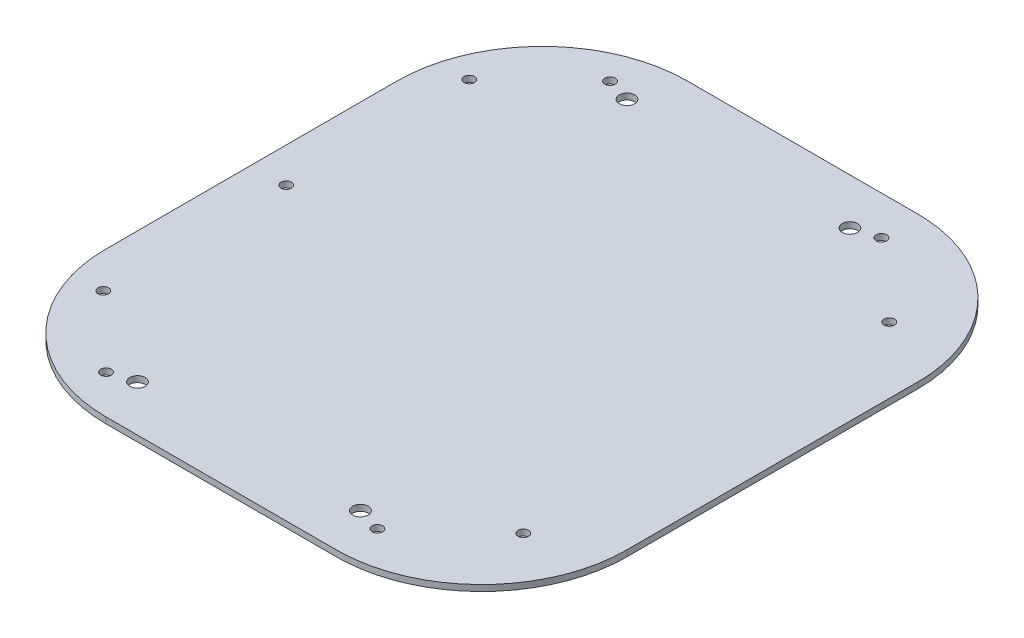
ISO-10303-21;
HEADER;
FILE_DESCRIPTION(('STEP AP214'),'2;1');
FILE_NAME('part.step','',(''),(''),'','','');
FILE_SCHEMA(('AUTOMOTIVE_DESIGN { 1 0 10303 214 1 1 1 1 }'));
ENDSEC;
DATA;
#1=APPLICATION_CONTEXT('core data for automotive mechanical design processes');
#2=APPLICATION_PROTOCOL_DEFINITION('international standard','automotive_design',2000,#1);
#3=PRODUCT_CONTEXT('',#1,'mechanical');
#4=PRODUCT('Part','Part','',(#3));
#5=PRODUCT_RELATED_PRODUCT_CATEGORY('part','',(#4));
#6=PRODUCT_DEFINITION_FORMATION('','',#4);
#7=PRODUCT_DEFINITION_CONTEXT('part definition',#1,'design');
#8=PRODUCT_DEFINITION('design','',#6,#7);
#9=PRODUCT_DEFINITION_SHAPE('','',#8);
#10=(LENGTH_UNIT() NAMED_UNIT(*) SI_UNIT(.MILLI.,.METRE.));
#11=(NAMED_UNIT(*) PLANE_ANGLE_UNIT() SI_UNIT($,.RADIAN.));
#12=(NAMED_UNIT(*) SI_UNIT($,.STERADIAN.) SOLID_ANGLE_UNIT());
#13=UNCERTAINTY_MEASURE_WITH_UNIT(LENGTH_MEASURE(1.E-05),#10,'distance_accuracy_value','');
#14=(GEOMETRIC_REPRESENTATION_CONTEXT(3) GLOBAL_UNCERTAINTY_ASSIGNED_CONTEXT((#13)) GLOBAL_UNIT_ASSIGNED_CONTEXT((#10,
#11,#12)) REPRESENTATION_CONTEXT('',''));
#15=CARTESIAN_POINT('',(0.,0.,0.));
#16=DIRECTION('',(0.,0.,1.));
#17=DIRECTION('',(1.,0.,0.));
#18=AXIS2_PLACEMENT_3D('',#15,#16,#17);
#19=CARTESIAN_POINT('',(95.2373145467114,-2.5,-179.995535183357));
#20=DIRECTION('',(0.,1.,0.));
#21=DIRECTION('',(0.,0.,1.));
#22=AXIS2_PLACEMENT_3D('',#19,#20,#21);
#23=PLANE('',#22);
#24=CARTESIAN_POINT('',(85.9999999999999,-2.5,-160.996));
#25=DIRECTION('',(0.,-1.,0.));
#26=DIRECTION('',(0.,0.,-1.));
#27=AXIS2_PLACEMENT_3D('',#24,#25,#26);
#28=CIRCLE('',#27,3.175);
#29=CARTESIAN_POINT('',(85.9999999999999,-2.5,-164.171));
#30=VERTEX_POINT('',#29);
#31=EDGE_CURVE('E340',#30,#30,#28,.T.);
#32=ORIENTED_EDGE('',*,*,#31,.F.);
#33=EDGE_LOOP('',(#32));
#34=FACE_BOUND('',#33,.T.);
#35=CARTESIAN_POINT('',(-16.,-2.5,-163.996));
#36=DIRECTION('',(0.,-1.,0.));
#37=DIRECTION('',(0.,0.,-1.));
#38=AXIS2_PLACEMENT_3D('',#35,#36,#37);
#39=CIRCLE('',#38,2.159);
#40=CARTESIAN_POINT('',(-16.,-2.5,-166.155));
#41=VERTEX_POINT('',#40);
#42=EDGE_CURVE('E327',#41,#41,#39,.T.);
#43=ORIENTED_EDGE('',*,*,#42,.F.);
#44=EDGE_LOOP('',(#43));
#45=FACE_BOUND('',#44,.T.);
#46=CARTESIAN_POINT('',(-45.6237582645307,-2.5,-135.496));
#47=DIRECTION('',(0.,-1.,0.));
#48=DIRECTION('',(0.,0.,-1.));
#49=AXIS2_PLACEMENT_3D('',#46,#47,#48);
#50=CIRCLE('',#49,2.159);
#51=CARTESIAN_POINT('',(-45.6237582645307,-2.5,-137.655));
#52=VERTEX_POINT('',#51);
#53=EDGE_CURVE('E324',#52,#52,#50,.T.);
#54=ORIENTED_EDGE('',*,*,#53,.F.);
#55=EDGE_LOOP('',(#54));
#56=FACE_BOUND('',#55,.T.);
#57=CARTESIAN_POINT('',(-6.,-2.5,41.));
#58=DIRECTION('',(0.,-1.,0.));
#59=DIRECTION('',(0.,0.,-1.));
#60=AXIS2_PLACEMENT_3D('',#57,#58,#59);
#61=CIRCLE('',#60,3.175);
#62=CARTESIAN_POINT('',(-6.,-2.5,37.825));
#63=VERTEX_POINT('',#62);
#64=EDGE_CURVE('E317',#63,#63,#61,.T.);
#65=ORIENTED_EDGE('',*,*,#64,.F.);
#66=EDGE_LOOP('',(#65));
#67=FACE_BOUND('',#66,.T.);
#68=CARTESIAN_POINT('',(85.9999999999999,-2.5,41.));
#69=DIRECTION('',(0.,-1.,0.));
#70=DIRECTION('',(0.,0.,-1.));
#71=AXIS2_PLACEMENT_3D('',#68,#69,#70);
#72=CIRCLE('',#71,3.175);
#73=CARTESIAN_POINT('',(85.9999999999999,-2.5,37.825));
#74=VERTEX_POINT('',#73);
#75=EDGE_CURVE('E316',#74,#74,#72,.T.);
#76=ORIENTED_EDGE('',*,*,#75,.F.);
#77=EDGE_LOOP('',(#76));
#78=FACE_BOUND('',#77,.T.);
#79=CARTESIAN_POINT('',(95.9999999999998,-2.5,44.));
#80=DIRECTION('',(0.,-1.,0.));
#81=DIRECTION('',(0.,0.,-1.));
#82=AXIS2_PLACEMENT_3D('',#79,#80,#81);
#83=CIRCLE('',#82,2.15899999999999);
#84=CARTESIAN_POINT('',(95.9999999999998,-2.5,41.841));
#85=VERTEX_POINT('',#84);
#86=EDGE_CURVE('E312',#85,#85,#83,.T.);
#87=ORIENTED_EDGE('',*,*,#86,.F.);
#88=EDGE_LOOP('',(#87));
#89=FACE_BOUND('',#88,.T.);
#90=CARTESIAN_POINT('',(-16.,-2.5,44.));
#91=DIRECTION('',(0.,-1.,0.));
#92=DIRECTION('',(0.,0.,-1.));
#93=AXIS2_PLACEMENT_3D('',#90,#91,#92);
#94=CIRCLE('',#93,2.159);
#95=CARTESIAN_POINT('',(-16.,-2.5,41.841));
#96=VERTEX_POINT('',#95);
#97=EDGE_CURVE('E311',#96,#96,#94,.T.);
#98=ORIENTED_EDGE('',*,*,#97,.F.);
#99=EDGE_LOOP('',(#98));
#100=FACE_BOUND('',#99,.T.);
#101=CARTESIAN_POINT('',(-45.6237582645307,-2.5,15.4999999999998));
#102=DIRECTION('',(0.,-1.,0.));
#103=DIRECTION('',(0.,0.,-1.));
#104=AXIS2_PLACEMENT_3D('',#101,#102,#103);
#105=CIRCLE('',#104,2.159);
#106=CARTESIAN_POINT('',(-45.6237582645307,-2.5,13.3409999999998));
#107=VERTEX_POINT('',#106);
#108=EDGE_CURVE('E307',#107,#107,#105,.T.);
#109=ORIENTED_EDGE('',*,*,#108,.F.);
#110=EDGE_LOOP('',(#109));
#111=FACE_BOUND('',#110,.T.);
#112=CARTESIAN_POINT('',(-45.6237582645307,-2.5,-59.998));
#113=DIRECTION('',(0.,-1.,0.));
#114=DIRECTION('',(0.,0.,-1.));
#115=AXIS2_PLACEMENT_3D('',#112,#113,#114);
#116=CIRCLE('',#115,2.159);
#117=CARTESIAN_POINT('',(-45.6237582645307,-2.5,-62.157));
#118=VERTEX_POINT('',#117);
#119=EDGE_CURVE('E303',#118,#118,#116,.T.);
#120=ORIENTED_EDGE('',*,*,#119,.F.);
#121=EDGE_LOOP('',(#120));
#122=FACE_BOUND('',#121,.T.);
#123=CARTESIAN_POINT('',(154.999999997937,-2.5,-119.9965));
#124=CARTESIAN_POINT('',(154.999912456205,-2.5,-130.604682867073));
#125=CARTESIAN_POINT('',(150.820797234942,-2.5,-146.047956153238));
#126=CARTESIAN_POINT('',(137.923088799103,-2.5,-162.919088799103));
#127=CARTESIAN_POINT('',(121.051823621961,-2.5,-175.816898552963));
#128=CARTESIAN_POINT('',(105.60835936,-2.5,-179.996));
#129=CARTESIAN_POINT('',(63.3333333333333,-2.5,-179.996));
#130=CARTESIAN_POINT('',(31.6666666666667,-2.5,-179.996));
#131=CARTESIAN_POINT('',(0.,-2.5,-179.996));
#132=B_SPLINE_CURVE_WITH_KNOTS('',3,(#123,#124,#125,#126,#127,#128,#129,#130,#131),
.UNSPECIFIED.,.F.,.F.,(4,1,1,1,2,4),(0.,0.167080312288074,0.250621780942753,0.334163249597432,
0.501246186906791,1.),.UNSPECIFIED.);
#133=CARTESIAN_POINT('',(155.,-2.5,-119.9965));
#134=VERTEX_POINT('',#133);
#135=CARTESIAN_POINT('',(0.,-2.5,-179.996));
#136=VERTEX_POINT('',#135);
#137=EDGE_CURVE('E405',#134,#136,#132,.T.);
#138=ORIENTED_EDGE('',*,*,#137,.F.);
#139=DIRECTION('',(1.71924646444001E-11,0.,-1.));
#140=VECTOR('',#139,1.);
#141=CARTESIAN_POINT('',(155.,-2.5,-119.9965));
#142=LINE('',#141,#140);
#143=CARTESIAN_POINT('',(154.999999997937,-2.5,0.000499999999985295));
#144=VERTEX_POINT('',#143);
#145=EDGE_CURVE('E224',#144,#134,#142,.T.);
#146=ORIENTED_EDGE('',*,*,#145,.F.);
#147=CARTESIAN_POINT('',(0.,-2.5,60.));
#148=CARTESIAN_POINT('',(31.6666666666667,-2.5,60.));
#149=CARTESIAN_POINT('',(63.3333333333333,-2.5,59.9999999999999));
#150=CARTESIAN_POINT('',(105.60835936,-2.5,60.));
#151=CARTESIAN_POINT('',(121.051823621961,-2.5,55.8208985529632));
#152=CARTESIAN_POINT('',(137.923088799103,-2.5,42.9230887991031));
#153=CARTESIAN_POINT('',(150.820797234942,-2.5,26.0519561532379));
#154=CARTESIAN_POINT('',(154.999912456205,-2.5,10.6086828670733));
#155=CARTESIAN_POINT('',(154.999999997937,-2.5,0.000499999999985295));
#156=B_SPLINE_CURVE_WITH_KNOTS('',3,(#147,#148,#149,#150,#151,#152,#153,#154,#155),
.UNSPECIFIED.,.F.,.F.,(4,2,1,1,1,4),(0.,0.498753813093209,0.665836750402568,0.749378219057247,
0.832919687711926,1.),.UNSPECIFIED.);
#157=CARTESIAN_POINT('',(0.,-2.5,60.));
#158=VERTEX_POINT('',#157);
#159=EDGE_CURVE('E206',#158,#144,#156,.T.);
#160=ORIENTED_EDGE('',*,*,#159,.F.);
#161=CARTESIAN_POINT('',(0.,-2.5,0.));
#162=DIRECTION('',(0.,1.,0.));
#163=DIRECTION('',(0.,0.,1.));
#164=AXIS2_PLACEMENT_3D('',#161,#162,#163);
#165=CIRCLE('',#164,60.);
#166=CARTESIAN_POINT('',(-60.,-2.5,-2.09488880330588E-13));
#167=VERTEX_POINT('',#166);
#168=EDGE_CURVE('E222',#167,#158,#165,.T.);
#169=ORIENTED_EDGE('',*,*,#168,.F.);
#170=DIRECTION('',(0.,0.,1.));
#171=VECTOR('',#170,1.);
#172=CARTESIAN_POINT('',(-60.,-2.5,-119.996));
#173=LINE('',#172,#171);
#174=CARTESIAN_POINT('',(-60.,-2.5,-119.996));
#175=VERTEX_POINT('',#174);
#176=EDGE_CURVE('E228',#175,#167,#173,.T.);
#177=ORIENTED_EDGE('',*,*,#176,.F.);
#178=CARTESIAN_POINT('',(0.,-2.5,-119.996));
#179=DIRECTION('',(0.,1.,0.));
#180=DIRECTION('',(0.,0.,1.));
#181=AXIS2_PLACEMENT_3D('',#178,#179,#180);
#182=CIRCLE('',#181,60.);
#183=EDGE_CURVE('E230',#136,#175,#182,.T.);
#184=ORIENTED_EDGE('',*,*,#183,.F.);
#185=EDGE_LOOP('',(#138,#146,#160,#169,#177,#184));
#186=FACE_BOUND('',#185,.T.);
#187=CARTESIAN_POINT('',(127.710665595896,-2.5,15.4999999999998));
#188=DIRECTION('',(0.,-1.,0.));
#189=DIRECTION('',(0.,0.,-1.));
#190=AXIS2_PLACEMENT_3D('',#187,#188,#189);
#191=CIRCLE('',#190,2.15899999999999);
#192=CARTESIAN_POINT('',(127.710665595896,-2.5,13.3409999999998));
#193=VERTEX_POINT('',#192);
#194=EDGE_CURVE('E299',#193,#193,#191,.T.);
#195=ORIENTED_EDGE('',*,*,#194,.F.);
#196=EDGE_LOOP('',(#195));
#197=FACE_BOUND('',#196,.T.);
#198=CARTESIAN_POINT('',(127.710665595896,-2.5,-135.496));
#199=DIRECTION('',(0.,-1.,0.));
#200=DIRECTION('',(0.,0.,-1.));
#201=AXIS2_PLACEMENT_3D('',#198,#199,#200);
#202=CIRCLE('',#201,2.15899999999999);
#203=CARTESIAN_POINT('',(127.710665595896,-2.5,-137.655));
#204=VERTEX_POINT('',#203);
#205=EDGE_CURVE('E321',#204,#204,#202,.T.);
#206=ORIENTED_EDGE('',*,*,#205,.F.);
#207=EDGE_LOOP('',(#206));
#208=FACE_BOUND('',#207,.T.);
#209=CARTESIAN_POINT('',(95.9999999999998,-2.5,-163.996));
#210=DIRECTION('',(0.,-1.,0.));
#211=DIRECTION('',(0.,0.,-1.));
#212=AXIS2_PLACEMENT_3D('',#209,#210,#211);
#213=CIRCLE('',#212,2.15899999999999);
#214=CARTESIAN_POINT('',(95.9999999999998,-2.5,-166.155));
#215=VERTEX_POINT('',#214);
#216=EDGE_CURVE('E328',#215,#215,#213,.T.);
#217=ORIENTED_EDGE('',*,*,#216,.F.);
#218=EDGE_LOOP('',(#217));
#219=FACE_BOUND('',#218,.T.);
#220=CARTESIAN_POINT('',(-6.,-2.5,-160.996));
#221=DIRECTION('',(0.,-1.,0.));
#222=DIRECTION('',(0.,0.,-1.));
#223=AXIS2_PLACEMENT_3D('',#220,#221,#222);
#224=CIRCLE('',#223,3.175);
#225=CARTESIAN_POINT('',(-6.,-2.5,-164.171));
#226=VERTEX_POINT('',#225);
#227=EDGE_CURVE('E523',#226,#226,#224,.T.);
#228=ORIENTED_EDGE('',*,*,#227,.F.);
#229=EDGE_LOOP('',(#228));
#230=FACE_BOUND('',#229,.T.);
#231=ADVANCED_FACE('F142',(#34,#45,#56,#67,#78,#89,#100,#111,#122,#186,#197,#208,#219,#230),#23,.F.);
#232=CARTESIAN_POINT('',(154.999999997937,-2.5,-119.9965));
#233=CARTESIAN_POINT('',(154.999912456205,-2.5,-130.604682867073));
#234=CARTESIAN_POINT('',(150.820797234942,-2.5,-146.047956153238));
#235=CARTESIAN_POINT('',(137.923088799103,-2.5,-162.919088799103));
#236=CARTESIAN_POINT('',(121.051823621961,-2.5,-175.816898552963));
#237=CARTESIAN_POINT('',(105.60835936,-2.5,-179.996));
#238=CARTESIAN_POINT('',(63.3333333333333,-2.5,-179.996));
#239=CARTESIAN_POINT('',(31.6666666666667,-2.5,-179.996));
#240=CARTESIAN_POINT('',(0.,-2.5,-179.996));
#241=B_SPLINE_CURVE_WITH_KNOTS('',3,(#232,#233,#234,#235,#236,#237,#238,#239,#240),
.UNSPECIFIED.,.F.,.F.,(4,1,1,1,2,4),(0.,0.167080312288074,0.250621780942753,0.334163249597432,
0.501246186906791,1.),.UNSPECIFIED.);
#242=DIRECTION('',(0.,1.,0.));
#243=VECTOR('',#242,1.);
#244=SURFACE_OF_LINEAR_EXTRUSION('',#241,#243);
#245=CARTESIAN_POINT('',(0.,0.,-179.996));
#246=CARTESIAN_POINT('',(31.6666666666667,0.,-179.996));
#247=CARTESIAN_POINT('',(63.3333333333333,0.,-179.996));
#248=CARTESIAN_POINT('',(105.60835936,0.,-179.996));
#249=CARTESIAN_POINT('',(121.051823621961,0.,-175.816898552963));
#250=CARTESIAN_POINT('',(137.923088799103,0.,-162.919088799103));
#251=CARTESIAN_POINT('',(150.820797234942,0.,-146.047956153238));
#252=CARTESIAN_POINT('',(154.999912456205,0.,-130.604682867073));
#253=CARTESIAN_POINT('',(154.999999997937,0.,-119.9965));
#254=B_SPLINE_CURVE_WITH_KNOTS('',3,(#245,#246,#247,#248,#249,#250,#251,#252,#253),
.UNSPECIFIED.,.F.,.F.,(4,2,1,1,1,4),(0.,0.498753813093209,0.665836750402568,0.749378219057247,
0.832919687711926,1.),.UNSPECIFIED.);
#255=CARTESIAN_POINT('',(155.,0.,-119.9965));
#256=VERTEX_POINT('',#255);
#257=CARTESIAN_POINT('',(0.,0.,-179.996));
#258=VERTEX_POINT('',#257);
#259=EDGE_CURVE('E281',#256,#258,#254,.F.);
#260=ORIENTED_EDGE('',*,*,#259,.F.);
#261=DIRECTION('',(0.,1.,0.));
#262=VECTOR('',#261,1.);
#263=CARTESIAN_POINT('',(155.,-2.5,-119.9965));
#264=LINE('',#263,#262);
#265=EDGE_CURVE('E13',#134,#256,#264,.T.);
#266=ORIENTED_EDGE('',*,*,#265,.F.);
#267=ORIENTED_EDGE('',*,*,#137,.T.);
#268=DIRECTION('',(0.,1.,0.));
#269=VECTOR('',#268,1.);
#270=CARTESIAN_POINT('',(0.,-2.5,-179.996));
#271=LINE('',#270,#269);
#272=EDGE_CURVE('E195',#136,#258,#271,.T.);
#273=ORIENTED_EDGE('',*,*,#272,.T.);
#274=EDGE_LOOP('',(#260,#266,#267,#273));
#275=FACE_BOUND('',#274,.T.);
#276=ADVANCED_FACE('F144',(#275),#244,.T.);
#277=CARTESIAN_POINT('',(155.,-2.5,-119.9965));
#278=DIRECTION('',(1.,0.,1.71924646444001E-11));
#279=DIRECTION('',(1.71924646444001E-11,0.,-1.));
#280=AXIS2_PLACEMENT_3D('',#277,#278,#279);
#281=PLANE('',#280);
#282=DIRECTION('',(1.71924646444001E-11,0.,-1.));
#283=VECTOR('',#282,1.);
#284=CARTESIAN_POINT('',(155.,0.,-119.9965));
#285=LINE('',#284,#283);
#286=CARTESIAN_POINT('',(154.999999997937,0.,0.000499999999985295));
#287=VERTEX_POINT('',#286);
#288=EDGE_CURVE('E403',#287,#256,#285,.T.);
#289=ORIENTED_EDGE('',*,*,#288,.F.);
#290=DIRECTION('',(0.,1.,0.));
#291=VECTOR('',#290,1.);
#292=CARTESIAN_POINT('',(154.999999997937,-2.5,0.000499999999985295));
#293=LINE('',#292,#291);
#294=EDGE_CURVE('E154',#144,#287,#293,.T.);
#295=ORIENTED_EDGE('',*,*,#294,.F.);
#296=ORIENTED_EDGE('',*,*,#145,.T.);
#297=ORIENTED_EDGE('',*,*,#265,.T.);
#298=EDGE_LOOP('',(#289,#295,#296,#297));
#299=FACE_BOUND('',#298,.T.);
#300=ADVANCED_FACE('F265',(#299),#281,.T.);
#301=CARTESIAN_POINT('',(0.,-2.5,60.));
#302=CARTESIAN_POINT('',(31.6666666666667,-2.5,60.));
#303=CARTESIAN_POINT('',(63.3333333333333,-2.5,59.9999999999999));
#304=CARTESIAN_POINT('',(105.60835936,-2.5,60.));
#305=CARTESIAN_POINT('',(121.051823621961,-2.5,55.8208985529632));
#306=CARTESIAN_POINT('',(137.923088799103,-2.5,42.9230887991031));
#307=CARTESIAN_POINT('',(150.820797234942,-2.5,26.0519561532379));
#308=CARTESIAN_POINT('',(154.999912456205,-2.5,10.6086828670733));
#309=CARTESIAN_POINT('',(154.999999997937,-2.5,0.000499999999985295));
#310=B_SPLINE_CURVE_WITH_KNOTS('',3,(#301,#302,#303,#304,#305,#306,#307,#308,#309),
.UNSPECIFIED.,.F.,.F.,(4,2,1,1,1,4),(0.,0.498753813093209,0.665836750402568,0.749378219057247,
0.832919687711926,1.),.UNSPECIFIED.);
#311=DIRECTION('',(0.,1.,0.));
#312=VECTOR('',#311,1.);
#313=SURFACE_OF_LINEAR_EXTRUSION('',#310,#312);
#314=CARTESIAN_POINT('',(154.999999997937,0.,0.000499999999985295));
#315=CARTESIAN_POINT('',(154.999912456205,0.,10.6086828670733));
#316=CARTESIAN_POINT('',(150.820797234942,0.,26.0519561532379));
#317=CARTESIAN_POINT('',(137.923088799103,0.,42.9230887991031));
#318=CARTESIAN_POINT('',(121.051823621961,0.,55.8208985529632));
#319=CARTESIAN_POINT('',(105.60835936,0.,60.));
#320=CARTESIAN_POINT('',(63.3333333333333,0.,59.9999999999999));
#321=CARTESIAN_POINT('',(31.6666666666667,0.,60.));
#322=CARTESIAN_POINT('',(0.,0.,60.));
#323=B_SPLINE_CURVE_WITH_KNOTS('',3,(#314,#315,#316,#317,#318,#319,#320,#321,#322),
.UNSPECIFIED.,.F.,.F.,(4,1,1,1,2,4),(0.,0.167080312288074,0.250621780942753,0.334163249597432,
0.501246186906791,1.),.UNSPECIFIED.);
#324=CARTESIAN_POINT('',(0.,0.,60.));
#325=VERTEX_POINT('',#324);
#326=EDGE_CURVE('E209',#325,#287,#323,.F.);
#327=ORIENTED_EDGE('',*,*,#326,.F.);
#328=DIRECTION('',(0.,1.,0.));
#329=VECTOR('',#328,1.);
#330=CARTESIAN_POINT('',(0.,-2.5,60.));
#331=LINE('',#330,#329);
#332=EDGE_CURVE('E203',#158,#325,#331,.T.);
#333=ORIENTED_EDGE('',*,*,#332,.F.);
#334=ORIENTED_EDGE('',*,*,#159,.T.);
#335=ORIENTED_EDGE('',*,*,#294,.T.);
#336=EDGE_LOOP('',(#327,#333,#334,#335));
#337=FACE_BOUND('',#336,.T.);
#338=ADVANCED_FACE('F205',(#337),#313,.T.);
#339=CARTESIAN_POINT('',(0.,-2.5,0.));
#340=DIRECTION('',(0.,1.,0.));
#341=DIRECTION('',(0.,0.,1.));
#342=AXIS2_PLACEMENT_3D('',#339,#340,#341);
#343=CYLINDRICAL_SURFACE('',#342,60.);
#344=CARTESIAN_POINT('',(0.,0.,0.));
#345=DIRECTION('',(0.,1.,0.));
#346=DIRECTION('',(0.,0.,1.));
#347=AXIS2_PLACEMENT_3D('',#344,#345,#346);
#348=CIRCLE('',#347,60.);
#349=CARTESIAN_POINT('',(-60.,0.,-2.09488880330588E-13));
#350=VERTEX_POINT('',#349);
#351=EDGE_CURVE('E394',#350,#325,#348,.T.);
#352=ORIENTED_EDGE('',*,*,#351,.F.);
#353=DIRECTION('',(0.,1.,0.));
#354=VECTOR('',#353,1.);
#355=CARTESIAN_POINT('',(-60.,-2.5,-2.09488880330588E-13));
#356=LINE('',#355,#354);
#357=EDGE_CURVE('E215',#167,#350,#356,.T.);
#358=ORIENTED_EDGE('',*,*,#357,.F.);
#359=ORIENTED_EDGE('',*,*,#168,.T.);
#360=ORIENTED_EDGE('',*,*,#332,.T.);
#361=EDGE_LOOP('',(#352,#358,#359,#360));
#362=FACE_BOUND('',#361,.T.);
#363=ADVANCED_FACE('F227',(#362),#343,.T.);
#364=CARTESIAN_POINT('',(-60.,-2.5,-119.996));
#365=DIRECTION('',(-1.,0.,0.));
#366=DIRECTION('',(0.,0.,1.));
#367=AXIS2_PLACEMENT_3D('',#364,#365,#366);
#368=PLANE('',#367);
#369=DIRECTION('',(0.,0.,1.));
#370=VECTOR('',#369,1.);
#371=CARTESIAN_POINT('',(-60.,0.,-119.996));
#372=LINE('',#371,#370);
#373=CARTESIAN_POINT('',(-60.,0.,-119.996));
#374=VERTEX_POINT('',#373);
#375=EDGE_CURVE('E293',#374,#350,#372,.T.);
#376=ORIENTED_EDGE('',*,*,#375,.F.);
#377=DIRECTION('',(0.,1.,0.));
#378=VECTOR('',#377,1.);
#379=CARTESIAN_POINT('',(-60.,-2.5,-119.996));
#380=LINE('',#379,#378);
#381=EDGE_CURVE('E429',#175,#374,#380,.T.);
#382=ORIENTED_EDGE('',*,*,#381,.F.);
#383=ORIENTED_EDGE('',*,*,#176,.T.);
#384=ORIENTED_EDGE('',*,*,#357,.T.);
#385=EDGE_LOOP('',(#376,#382,#383,#384));
#386=FACE_BOUND('',#385,.T.);
#387=ADVANCED_FACE('F435',(#386),#368,.T.);
#388=CARTESIAN_POINT('',(0.,-2.5,-119.996));
#389=DIRECTION('',(0.,1.,0.));
#390=DIRECTION('',(0.,0.,1.));
#391=AXIS2_PLACEMENT_3D('',#388,#389,#390);
#392=CYLINDRICAL_SURFACE('',#391,60.);
#393=CARTESIAN_POINT('',(0.,0.,-119.996));
#394=DIRECTION('',(0.,1.,0.));
#395=DIRECTION('',(0.,0.,1.));
#396=AXIS2_PLACEMENT_3D('',#393,#394,#395);
#397=CIRCLE('',#396,60.);
#398=EDGE_CURVE('E285',#258,#374,#397,.T.);
#399=ORIENTED_EDGE('',*,*,#398,.F.);
#400=ORIENTED_EDGE('',*,*,#272,.F.);
#401=ORIENTED_EDGE('',*,*,#183,.T.);
#402=ORIENTED_EDGE('',*,*,#381,.T.);
#403=EDGE_LOOP('',(#399,#400,#401,#402));
#404=FACE_BOUND('',#403,.T.);
#405=ADVANCED_FACE('F261',(#404),#392,.T.);
#406=CARTESIAN_POINT('',(95.2373145467114,0.,-179.995535183357));
#407=DIRECTION('',(0.,1.,0.));
#408=DIRECTION('',(0.,0.,1.));
#409=AXIS2_PLACEMENT_3D('',#406,#407,#408);
#410=PLANE('',#409);
#411=CARTESIAN_POINT('',(-6.,0.,-160.996));
#412=DIRECTION('',(0.,1.,0.));
#413=DIRECTION('',(0.,0.,1.));
#414=AXIS2_PLACEMENT_3D('',#411,#412,#413);
#415=CIRCLE('',#414,3.175);
#416=CARTESIAN_POINT('',(-6.,0.,-157.821));
#417=VERTEX_POINT('',#416);
#418=EDGE_CURVE('E148',#417,#417,#415,.T.);
#419=ORIENTED_EDGE('',*,*,#418,.F.);
#420=EDGE_LOOP('',(#419));
#421=FACE_BOUND('',#420,.T.);
#422=CARTESIAN_POINT('',(85.9999999999999,0.,-160.996));
#423=DIRECTION('',(0.,1.,0.));
#424=DIRECTION('',(0.,0.,1.));
#425=AXIS2_PLACEMENT_3D('',#422,#423,#424);
#426=CIRCLE('',#425,3.175);
#427=CARTESIAN_POINT('',(85.9999999999999,0.,-157.821));
#428=VERTEX_POINT('',#427);
#429=EDGE_CURVE('E335',#428,#428,#426,.T.);
#430=ORIENTED_EDGE('',*,*,#429,.F.);
#431=EDGE_LOOP('',(#430));
#432=FACE_BOUND('',#431,.T.);
#433=CARTESIAN_POINT('',(95.9999999999998,0.,-163.996));
#434=DIRECTION('',(0.,1.,0.));
#435=DIRECTION('',(0.,0.,1.));
#436=AXIS2_PLACEMENT_3D('',#433,#434,#435);
#437=CIRCLE('',#436,2.15899999999999);
#438=CARTESIAN_POINT('',(95.9999999999998,0.,-161.837));
#439=VERTEX_POINT('',#438);
#440=EDGE_CURVE('E325',#439,#439,#437,.T.);
#441=ORIENTED_EDGE('',*,*,#440,.F.);
#442=EDGE_LOOP('',(#441));
#443=FACE_BOUND('',#442,.T.);
#444=CARTESIAN_POINT('',(-16.,0.,-163.996));
#445=DIRECTION('',(0.,1.,0.));
#446=DIRECTION('',(0.,0.,1.));
#447=AXIS2_PLACEMENT_3D('',#444,#445,#446);
#448=CIRCLE('',#447,2.159);
#449=CARTESIAN_POINT('',(-16.,0.,-161.837));
#450=VERTEX_POINT('',#449);
#451=EDGE_CURVE('E332',#450,#450,#448,.T.);
#452=ORIENTED_EDGE('',*,*,#451,.F.);
#453=EDGE_LOOP('',(#452));
#454=FACE_BOUND('',#453,.T.);
#455=CARTESIAN_POINT('',(-45.6237582645307,0.,-135.496));
#456=DIRECTION('',(0.,1.,0.));
#457=DIRECTION('',(0.,0.,1.));
#458=AXIS2_PLACEMENT_3D('',#455,#456,#457);
#459=CIRCLE('',#458,2.159);
#460=CARTESIAN_POINT('',(-45.6237582645307,0.,-133.337));
#461=VERTEX_POINT('',#460);
#462=EDGE_CURVE('E322',#461,#461,#459,.T.);
#463=ORIENTED_EDGE('',*,*,#462,.F.);
#464=EDGE_LOOP('',(#463));
#465=FACE_BOUND('',#464,.T.);
#466=CARTESIAN_POINT('',(127.710665595896,0.,-135.496));
#467=DIRECTION('',(0.,1.,0.));
#468=DIRECTION('',(0.,0.,1.));
#469=AXIS2_PLACEMENT_3D('',#466,#467,#468);
#470=CIRCLE('',#469,2.15899999999999);
#471=CARTESIAN_POINT('',(127.710665595896,0.,-133.337));
#472=VERTEX_POINT('',#471);
#473=EDGE_CURVE('E318',#472,#472,#470,.T.);
#474=ORIENTED_EDGE('',*,*,#473,.F.);
#475=EDGE_LOOP('',(#474));
#476=FACE_BOUND('',#475,.T.);
#477=CARTESIAN_POINT('',(-6.,0.,41.));
#478=DIRECTION('',(0.,1.,0.));
#479=DIRECTION('',(0.,0.,1.));
#480=AXIS2_PLACEMENT_3D('',#477,#478,#479);
#481=CIRCLE('',#480,3.175);
#482=CARTESIAN_POINT('',(-6.,0.,44.175));
#483=VERTEX_POINT('',#482);
#484=EDGE_CURVE('E313',#483,#483,#481,.T.);
#485=ORIENTED_EDGE('',*,*,#484,.F.);
#486=EDGE_LOOP('',(#485));
#487=FACE_BOUND('',#486,.T.);
#488=CARTESIAN_POINT('',(85.9999999999999,0.,41.));
#489=DIRECTION('',(0.,1.,0.));
#490=DIRECTION('',(0.,0.,1.));
#491=AXIS2_PLACEMENT_3D('',#488,#489,#490);
#492=CIRCLE('',#491,3.175);
#493=CARTESIAN_POINT('',(85.9999999999999,0.,44.175));
#494=VERTEX_POINT('',#493);
#495=EDGE_CURVE('E354',#494,#494,#492,.T.);
#496=ORIENTED_EDGE('',*,*,#495,.F.);
#497=EDGE_LOOP('',(#496));
#498=FACE_BOUND('',#497,.T.);
#499=CARTESIAN_POINT('',(95.9999999999998,0.,44.));
#500=DIRECTION('',(0.,1.,0.));
#501=DIRECTION('',(0.,0.,1.));
#502=AXIS2_PLACEMENT_3D('',#499,#500,#501);
#503=CIRCLE('',#502,2.15899999999999);
#504=CARTESIAN_POINT('',(95.9999999999998,0.,46.159));
#505=VERTEX_POINT('',#504);
#506=EDGE_CURVE('E308',#505,#505,#503,.T.);
#507=ORIENTED_EDGE('',*,*,#506,.F.);
#508=EDGE_LOOP('',(#507));
#509=FACE_BOUND('',#508,.T.);
#510=CARTESIAN_POINT('',(-16.,0.,44.));
#511=DIRECTION('',(0.,1.,0.));
#512=DIRECTION('',(0.,0.,1.));
#513=AXIS2_PLACEMENT_3D('',#510,#511,#512);
#514=CIRCLE('',#513,2.159);
#515=CARTESIAN_POINT('',(-16.,0.,46.159));
#516=VERTEX_POINT('',#515);
#517=EDGE_CURVE('E361',#516,#516,#514,.T.);
#518=ORIENTED_EDGE('',*,*,#517,.F.);
#519=EDGE_LOOP('',(#518));
#520=FACE_BOUND('',#519,.T.);
#521=CARTESIAN_POINT('',(-45.6237582645307,0.,15.4999999999998));
#522=DIRECTION('',(0.,1.,0.));
#523=DIRECTION('',(0.,0.,1.));
#524=AXIS2_PLACEMENT_3D('',#521,#522,#523);
#525=CIRCLE('',#524,2.159);
#526=CARTESIAN_POINT('',(-45.6237582645307,0.,17.6589999999998));
#527=VERTEX_POINT('',#526);
#528=EDGE_CURVE('E304',#527,#527,#525,.T.);
#529=ORIENTED_EDGE('',*,*,#528,.F.);
#530=EDGE_LOOP('',(#529));
#531=FACE_BOUND('',#530,.T.);
#532=CARTESIAN_POINT('',(-45.6237582645307,0.,-59.998));
#533=DIRECTION('',(0.,1.,0.));
#534=DIRECTION('',(0.,0.,1.));
#535=AXIS2_PLACEMENT_3D('',#532,#533,#534);
#536=CIRCLE('',#535,2.159);
#537=CARTESIAN_POINT('',(-45.6237582645307,0.,-57.839));
#538=VERTEX_POINT('',#537);
#539=EDGE_CURVE('E300',#538,#538,#536,.T.);
#540=ORIENTED_EDGE('',*,*,#539,.F.);
#541=EDGE_LOOP('',(#540));
#542=FACE_BOUND('',#541,.T.);
#543=CARTESIAN_POINT('',(127.710665595896,0.,15.4999999999998));
#544=DIRECTION('',(0.,1.,0.));
#545=DIRECTION('',(0.,0.,1.));
#546=AXIS2_PLACEMENT_3D('',#543,#544,#545);
#547=CIRCLE('',#546,2.15899999999999);
#548=CARTESIAN_POINT('',(127.710665595896,0.,17.6589999999998));
#549=VERTEX_POINT('',#548);
#550=EDGE_CURVE('E296',#549,#549,#547,.T.);
#551=ORIENTED_EDGE('',*,*,#550,.F.);
#552=EDGE_LOOP('',(#551));
#553=FACE_BOUND('',#552,.T.);
#554=ORIENTED_EDGE('',*,*,#259,.T.);
#555=ORIENTED_EDGE('',*,*,#398,.T.);
#556=ORIENTED_EDGE('',*,*,#375,.T.);
#557=ORIENTED_EDGE('',*,*,#351,.T.);
#558=ORIENTED_EDGE('',*,*,#326,.T.);
#559=ORIENTED_EDGE('',*,*,#288,.T.);
#560=EDGE_LOOP('',(#554,#555,#556,#557,#558,#559));
#561=FACE_BOUND('',#560,.T.);
#562=ADVANCED_FACE('F250',(#421,#432,#443,#454,#465,#476,#487,#498,#509,#520,#531,#542,#553,
#561),#410,.T.);
#563=CARTESIAN_POINT('',(127.710665595896,-2.5,15.4999999999998));
#564=DIRECTION('',(0.,-1.,0.));
#565=DIRECTION('',(0.,0.,-1.));
#566=AXIS2_PLACEMENT_3D('',#563,#564,#565);
#567=CYLINDRICAL_SURFACE('',#566,2.15899999999999);
#568=ORIENTED_EDGE('',*,*,#550,.T.);
#569=EDGE_LOOP('',(#568));
#570=FACE_BOUND('',#569,.T.);
#571=ORIENTED_EDGE('',*,*,#194,.T.);
#572=EDGE_LOOP('',(#571));
#573=FACE_BOUND('',#572,.T.);
#574=ADVANCED_FACE('F260',(#570,#573),#567,.F.);
#575=CARTESIAN_POINT('',(-45.6237582645307,-2.5,-59.998));
#576=DIRECTION('',(0.,-1.,0.));
#577=DIRECTION('',(0.,0.,-1.));
#578=AXIS2_PLACEMENT_3D('',#575,#576,#577);
#579=CYLINDRICAL_SURFACE('',#578,2.159);
#580=ORIENTED_EDGE('',*,*,#539,.T.);
#581=EDGE_LOOP('',(#580));
#582=FACE_BOUND('',#581,.T.);
#583=ORIENTED_EDGE('',*,*,#119,.T.);
#584=EDGE_LOOP('',(#583));
#585=FACE_BOUND('',#584,.T.);
#586=ADVANCED_FACE('F465',(#582,#585),#579,.F.);
#587=CARTESIAN_POINT('',(-45.6237582645307,-2.5,15.4999999999998));
#588=DIRECTION('',(0.,-1.,0.));
#589=DIRECTION('',(0.,0.,-1.));
#590=AXIS2_PLACEMENT_3D('',#587,#588,#589);
#591=CYLINDRICAL_SURFACE('',#590,2.159);
#592=ORIENTED_EDGE('',*,*,#528,.T.);
#593=EDGE_LOOP('',(#592));
#594=FACE_BOUND('',#593,.T.);
#595=ORIENTED_EDGE('',*,*,#108,.T.);
#596=EDGE_LOOP('',(#595));
#597=FACE_BOUND('',#596,.T.);
#598=ADVANCED_FACE('F467',(#594,#597),#591,.F.);
#599=CARTESIAN_POINT('',(-16.,-2.5,44.));
#600=DIRECTION('',(0.,-1.,0.));
#601=DIRECTION('',(0.,0.,-1.));
#602=AXIS2_PLACEMENT_3D('',#599,#600,#601);
#603=CYLINDRICAL_SURFACE('',#602,2.159);
#604=ORIENTED_EDGE('',*,*,#517,.T.);
#605=EDGE_LOOP('',(#604));
#606=FACE_BOUND('',#605,.T.);
#607=ORIENTED_EDGE('',*,*,#97,.T.);
#608=EDGE_LOOP('',(#607));
#609=FACE_BOUND('',#608,.T.);
#610=ADVANCED_FACE('F474',(#606,#609),#603,.F.);
#611=CARTESIAN_POINT('',(95.9999999999998,-2.5,44.));
#612=DIRECTION('',(0.,-1.,0.));
#613=DIRECTION('',(0.,0.,-1.));
#614=AXIS2_PLACEMENT_3D('',#611,#612,#613);
#615=CYLINDRICAL_SURFACE('',#614,2.15899999999999);
#616=ORIENTED_EDGE('',*,*,#506,.T.);
#617=EDGE_LOOP('',(#616));
#618=FACE_BOUND('',#617,.T.);
#619=ORIENTED_EDGE('',*,*,#86,.T.);
#620=EDGE_LOOP('',(#619));
#621=FACE_BOUND('',#620,.T.);
#622=ADVANCED_FACE('F481',(#618,#621),#615,.F.);
#623=CARTESIAN_POINT('',(85.9999999999999,-2.5,41.));
#624=DIRECTION('',(0.,-1.,0.));
#625=DIRECTION('',(0.,0.,-1.));
#626=AXIS2_PLACEMENT_3D('',#623,#624,#625);
#627=CYLINDRICAL_SURFACE('',#626,3.175);
#628=ORIENTED_EDGE('',*,*,#495,.T.);
#629=EDGE_LOOP('',(#628));
#630=FACE_BOUND('',#629,.T.);
#631=ORIENTED_EDGE('',*,*,#75,.T.);
#632=EDGE_LOOP('',(#631));
#633=FACE_BOUND('',#632,.T.);
#634=ADVANCED_FACE('F485',(#630,#633),#627,.F.);
#635=CARTESIAN_POINT('',(-6.,-2.5,41.));
#636=DIRECTION('',(0.,-1.,0.));
#637=DIRECTION('',(0.,0.,-1.));
#638=AXIS2_PLACEMENT_3D('',#635,#636,#637);
#639=CYLINDRICAL_SURFACE('',#638,3.175);
#640=ORIENTED_EDGE('',*,*,#484,.T.);
#641=EDGE_LOOP('',(#640));
#642=FACE_BOUND('',#641,.T.);
#643=ORIENTED_EDGE('',*,*,#64,.T.);
#644=EDGE_LOOP('',(#643));
#645=FACE_BOUND('',#644,.T.);
#646=ADVANCED_FACE('F489',(#642,#645),#639,.F.);
#647=CARTESIAN_POINT('',(127.710665595896,-2.5,-135.496));
#648=DIRECTION('',(0.,-1.,0.));
#649=DIRECTION('',(0.,0.,-1.));
#650=AXIS2_PLACEMENT_3D('',#647,#648,#649);
#651=CYLINDRICAL_SURFACE('',#650,2.15899999999999);
#652=ORIENTED_EDGE('',*,*,#473,.T.);
#653=EDGE_LOOP('',(#652));
#654=FACE_BOUND('',#653,.T.);
#655=ORIENTED_EDGE('',*,*,#205,.T.);
#656=EDGE_LOOP('',(#655));
#657=FACE_BOUND('',#656,.T.);
#658=ADVANCED_FACE('F493',(#654,#657),#651,.F.);
#659=CARTESIAN_POINT('',(-45.6237582645307,-2.5,-135.496));
#660=DIRECTION('',(0.,-1.,0.));
#661=DIRECTION('',(0.,0.,-1.));
#662=AXIS2_PLACEMENT_3D('',#659,#660,#661);
#663=CYLINDRICAL_SURFACE('',#662,2.159);
#664=ORIENTED_EDGE('',*,*,#462,.T.);
#665=EDGE_LOOP('',(#664));
#666=FACE_BOUND('',#665,.T.);
#667=ORIENTED_EDGE('',*,*,#53,.T.);
#668=EDGE_LOOP('',(#667));
#669=FACE_BOUND('',#668,.T.);
#670=ADVANCED_FACE('F497',(#666,#669),#663,.F.);
#671=CARTESIAN_POINT('',(-16.,-2.5,-163.996));
#672=DIRECTION('',(0.,-1.,0.));
#673=DIRECTION('',(0.,0.,-1.));
#674=AXIS2_PLACEMENT_3D('',#671,#672,#673);
#675=CYLINDRICAL_SURFACE('',#674,2.159);
#676=ORIENTED_EDGE('',*,*,#451,.T.);
#677=EDGE_LOOP('',(#676));
#678=FACE_BOUND('',#677,.T.);
#679=ORIENTED_EDGE('',*,*,#42,.T.);
#680=EDGE_LOOP('',(#679));
#681=FACE_BOUND('',#680,.T.);
#682=ADVANCED_FACE('F501',(#678,#681),#675,.F.);
#683=CARTESIAN_POINT('',(95.9999999999998,-2.5,-163.996));
#684=DIRECTION('',(0.,-1.,0.));
#685=DIRECTION('',(0.,0.,-1.));
#686=AXIS2_PLACEMENT_3D('',#683,#684,#685);
#687=CYLINDRICAL_SURFACE('',#686,2.15899999999999);
#688=ORIENTED_EDGE('',*,*,#440,.T.);
#689=EDGE_LOOP('',(#688));
#690=FACE_BOUND('',#689,.T.);
#691=ORIENTED_EDGE('',*,*,#216,.T.);
#692=EDGE_LOOP('',(#691));
#693=FACE_BOUND('',#692,.T.);
#694=ADVANCED_FACE('F505',(#690,#693),#687,.F.);
#695=CARTESIAN_POINT('',(85.9999999999999,-2.5,-160.996));
#696=DIRECTION('',(0.,-1.,0.));
#697=DIRECTION('',(0.,0.,-1.));
#698=AXIS2_PLACEMENT_3D('',#695,#696,#697);
#699=CYLINDRICAL_SURFACE('',#698,3.175);
#700=ORIENTED_EDGE('',*,*,#429,.T.);
#701=EDGE_LOOP('',(#700));
#702=FACE_BOUND('',#701,.T.);
#703=ORIENTED_EDGE('',*,*,#31,.T.);
#704=EDGE_LOOP('',(#703));
#705=FACE_BOUND('',#704,.T.);
#706=ADVANCED_FACE('F509',(#702,#705),#699,.F.);
#707=CARTESIAN_POINT('',(-6.,-2.5,-160.996));
#708=DIRECTION('',(0.,-1.,0.));
#709=DIRECTION('',(0.,0.,-1.));
#710=AXIS2_PLACEMENT_3D('',#707,#708,#709);
#711=CYLINDRICAL_SURFACE('',#710,3.175);
#712=ORIENTED_EDGE('',*,*,#418,.T.);
#713=EDGE_LOOP('',(#712));
#714=FACE_BOUND('',#713,.T.);
#715=ORIENTED_EDGE('',*,*,#227,.T.);
#716=EDGE_LOOP('',(#715));
#717=FACE_BOUND('',#716,.T.);
#718=ADVANCED_FACE('F512',(#714,#717),#711,.F.);
#719=CLOSED_SHELL('',(#231,#276,#300,#338,#363,#387,#405,#562,#574,#586,#598,#610,#622,#634,
#646,#658,#670,#682,#694,#706,#718));
#720=MANIFOLD_SOLID_BREP('B2',#719);
#721=ADVANCED_BREP_SHAPE_REPRESENTATION('',(#18,#720),#14);
#722=SHAPE_DEFINITION_REPRESENTATION(#9,#721);
ENDSEC;
END-ISO-10303-21;
